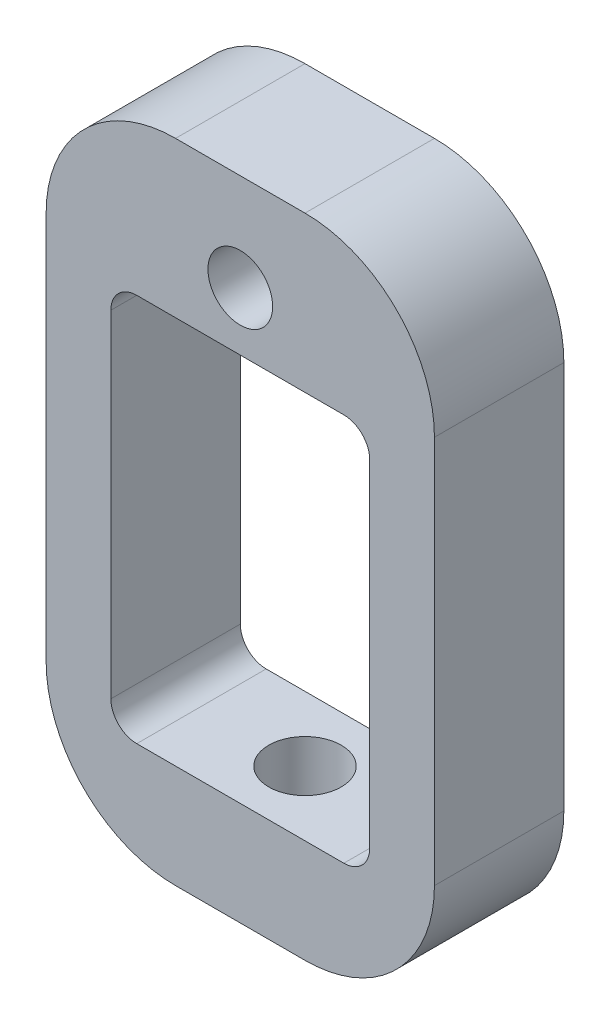
ISO-10303-21;
HEADER;
FILE_DESCRIPTION(('STEP AP214'),'2;1');
FILE_NAME('part.step','',(''),(''),'','','');
FILE_SCHEMA(('AUTOMOTIVE_DESIGN { 1 0 10303 214 1 1 1 1 }'));
ENDSEC;
DATA;
#1=APPLICATION_CONTEXT('core data for automotive mechanical design processes');
#2=APPLICATION_PROTOCOL_DEFINITION('international standard','automotive_design',2000,#1);
#3=PRODUCT_CONTEXT('',#1,'mechanical');
#4=PRODUCT('Part','Part','',(#3));
#5=PRODUCT_RELATED_PRODUCT_CATEGORY('part','',(#4));
#6=PRODUCT_DEFINITION_FORMATION('','',#4);
#7=PRODUCT_DEFINITION_CONTEXT('part definition',#1,'design');
#8=PRODUCT_DEFINITION('design','',#6,#7);
#9=PRODUCT_DEFINITION_SHAPE('','',#8);
#10=(LENGTH_UNIT() NAMED_UNIT(*) SI_UNIT(.MILLI.,.METRE.));
#11=(NAMED_UNIT(*) PLANE_ANGLE_UNIT() SI_UNIT($,.RADIAN.));
#12=(NAMED_UNIT(*) SI_UNIT($,.STERADIAN.) SOLID_ANGLE_UNIT());
#13=UNCERTAINTY_MEASURE_WITH_UNIT(LENGTH_MEASURE(1.E-05),#10,'distance_accuracy_value','');
#14=(GEOMETRIC_REPRESENTATION_CONTEXT(3) GLOBAL_UNCERTAINTY_ASSIGNED_CONTEXT((#13)) GLOBAL_UNIT_ASSIGNED_CONTEXT((#10,
#11,#12)) REPRESENTATION_CONTEXT('',''));
#15=CARTESIAN_POINT('',(0.,0.,0.));
#16=DIRECTION('',(0.,0.,1.));
#17=DIRECTION('',(1.,0.,0.));
#18=AXIS2_PLACEMENT_3D('',#15,#16,#17);
#19=CARTESIAN_POINT('',(0.,0.,5.));
#20=DIRECTION('',(0.,0.,1.));
#21=DIRECTION('',(1.,0.,0.));
#22=AXIS2_PLACEMENT_3D('',#19,#20,#21);
#23=PLANE('',#22);
#24=DIRECTION('',(-1.,0.,0.));
#25=VECTOR('',#24,1.);
#26=CARTESIAN_POINT('',(2.5,-6.,5.));
#27=LINE('',#26,#25);
#28=CARTESIAN_POINT('',(11.5,-6.,5.));
#29=VERTEX_POINT('',#28);
#30=CARTESIAN_POINT('',(3.5,-6.,5.));
#31=VERTEX_POINT('',#30);
#32=EDGE_CURVE('E306',#29,#31,#27,.T.);
#33=ORIENTED_EDGE('',*,*,#32,.F.);
#34=CARTESIAN_POINT('',(11.5,-7.,5.));
#35=DIRECTION('',(0.,0.,1.));
#36=DIRECTION('',(1.,0.,0.));
#37=AXIS2_PLACEMENT_3D('',#34,#35,#36);
#38=CIRCLE('',#37,1.);
#39=CARTESIAN_POINT('',(12.5,-7.,5.));
#40=VERTEX_POINT('',#39);
#41=EDGE_CURVE('E273',#29,#40,#38,.F.);
#42=ORIENTED_EDGE('',*,*,#41,.T.);
#43=DIRECTION('',(0.,1.,0.));
#44=VECTOR('',#43,1.);
#45=CARTESIAN_POINT('',(12.5,-6.,5.));
#46=LINE('',#45,#44);
#47=CARTESIAN_POINT('',(12.5,-20.,5.));
#48=VERTEX_POINT('',#47);
#49=EDGE_CURVE('E292',#48,#40,#46,.T.);
#50=ORIENTED_EDGE('',*,*,#49,.F.);
#51=CARTESIAN_POINT('',(11.5,-20.,5.));
#52=DIRECTION('',(0.,0.,1.));
#53=DIRECTION('',(1.,0.,0.));
#54=AXIS2_PLACEMENT_3D('',#51,#52,#53);
#55=CIRCLE('',#54,1.);
#56=CARTESIAN_POINT('',(11.5,-21.,5.));
#57=VERTEX_POINT('',#56);
#58=EDGE_CURVE('E55',#48,#57,#55,.F.);
#59=ORIENTED_EDGE('',*,*,#58,.T.);
#60=DIRECTION('',(1.,0.,0.));
#61=VECTOR('',#60,1.);
#62=CARTESIAN_POINT('',(2.5,-21.,5.));
#63=LINE('',#62,#61);
#64=CARTESIAN_POINT('',(3.5,-21.,5.));
#65=VERTEX_POINT('',#64);
#66=EDGE_CURVE('E301',#65,#57,#63,.T.);
#67=ORIENTED_EDGE('',*,*,#66,.F.);
#68=CARTESIAN_POINT('',(3.5,-20.,5.));
#69=DIRECTION('',(0.,0.,1.));
#70=DIRECTION('',(1.,0.,0.));
#71=AXIS2_PLACEMENT_3D('',#68,#69,#70);
#72=CIRCLE('',#71,1.);
#73=CARTESIAN_POINT('',(2.5,-20.,5.));
#74=VERTEX_POINT('',#73);
#75=EDGE_CURVE('E11',#65,#74,#72,.F.);
#76=ORIENTED_EDGE('',*,*,#75,.T.);
#77=DIRECTION('',(0.,-1.,0.));
#78=VECTOR('',#77,1.);
#79=CARTESIAN_POINT('',(2.5,-6.,5.));
#80=LINE('',#79,#78);
#81=CARTESIAN_POINT('',(2.5,-7.,5.));
#82=VERTEX_POINT('',#81);
#83=EDGE_CURVE('E299',#82,#74,#80,.T.);
#84=ORIENTED_EDGE('',*,*,#83,.F.);
#85=CARTESIAN_POINT('',(3.5,-7.,5.));
#86=DIRECTION('',(0.,0.,1.));
#87=DIRECTION('',(1.,0.,0.));
#88=AXIS2_PLACEMENT_3D('',#85,#86,#87);
#89=CIRCLE('',#88,1.);
#90=EDGE_CURVE('E267',#82,#31,#89,.F.);
#91=ORIENTED_EDGE('',*,*,#90,.T.);
#92=EDGE_LOOP('',(#33,#42,#50,#59,#67,#76,#84,#91));
#93=FACE_BOUND('',#92,.T.);
#94=DIRECTION('',(1.,0.,0.));
#95=VECTOR('',#94,1.);
#96=CARTESIAN_POINT('',(0.,-25.,5.));
#97=LINE('',#96,#95);
#98=CARTESIAN_POINT('',(5.,-25.,5.));
#99=VERTEX_POINT('',#98);
#100=CARTESIAN_POINT('',(10.,-25.,5.));
#101=VERTEX_POINT('',#100);
#102=EDGE_CURVE('E329',#99,#101,#97,.T.);
#103=ORIENTED_EDGE('',*,*,#102,.T.);
#104=CARTESIAN_POINT('',(10.,-20.,5.));
#105=DIRECTION('',(0.,0.,1.));
#106=DIRECTION('',(1.,0.,0.));
#107=AXIS2_PLACEMENT_3D('',#104,#105,#106);
#108=CIRCLE('',#107,5.);
#109=CARTESIAN_POINT('',(15.,-20.,5.));
#110=VERTEX_POINT('',#109);
#111=EDGE_CURVE('E220',#101,#110,#108,.T.);
#112=ORIENTED_EDGE('',*,*,#111,.T.);
#113=DIRECTION('',(0.,1.,0.));
#114=VECTOR('',#113,1.);
#115=CARTESIAN_POINT('',(15.,0.,5.));
#116=LINE('',#115,#114);
#117=CARTESIAN_POINT('',(15.,-5.,5.));
#118=VERTEX_POINT('',#117);
#119=EDGE_CURVE('E175',#110,#118,#116,.T.);
#120=ORIENTED_EDGE('',*,*,#119,.T.);
#121=CARTESIAN_POINT('',(10.,-5.,5.));
#122=DIRECTION('',(0.,0.,1.));
#123=DIRECTION('',(1.,0.,0.));
#124=AXIS2_PLACEMENT_3D('',#121,#122,#123);
#125=CIRCLE('',#124,5.);
#126=CARTESIAN_POINT('',(9.99999999999999,0.,5.));
#127=VERTEX_POINT('',#126);
#128=EDGE_CURVE('E214',#118,#127,#125,.T.);
#129=ORIENTED_EDGE('',*,*,#128,.T.);
#130=DIRECTION('',(-1.,0.,0.));
#131=VECTOR('',#130,1.);
#132=CARTESIAN_POINT('',(0.,0.,5.));
#133=LINE('',#132,#131);
#134=CARTESIAN_POINT('',(5.,0.,5.));
#135=VERTEX_POINT('',#134);
#136=EDGE_CURVE('E198',#127,#135,#133,.T.);
#137=ORIENTED_EDGE('',*,*,#136,.T.);
#138=CARTESIAN_POINT('',(5.,-5.,5.));
#139=DIRECTION('',(0.,0.,1.));
#140=DIRECTION('',(1.,0.,0.));
#141=AXIS2_PLACEMENT_3D('',#138,#139,#140);
#142=CIRCLE('',#141,5.);
#143=CARTESIAN_POINT('',(0.,-5.,5.));
#144=VERTEX_POINT('',#143);
#145=EDGE_CURVE('E211',#135,#144,#142,.T.);
#146=ORIENTED_EDGE('',*,*,#145,.T.);
#147=DIRECTION('',(0.,-1.,0.));
#148=VECTOR('',#147,1.);
#149=CARTESIAN_POINT('',(0.,0.,5.));
#150=LINE('',#149,#148);
#151=CARTESIAN_POINT('',(0.,-20.,5.));
#152=VERTEX_POINT('',#151);
#153=EDGE_CURVE('E191',#144,#152,#150,.T.);
#154=ORIENTED_EDGE('',*,*,#153,.T.);
#155=CARTESIAN_POINT('',(5.,-20.,5.));
#156=DIRECTION('',(0.,0.,1.));
#157=DIRECTION('',(1.,0.,0.));
#158=AXIS2_PLACEMENT_3D('',#155,#156,#157);
#159=CIRCLE('',#158,5.);
#160=EDGE_CURVE('E217',#152,#99,#159,.T.);
#161=ORIENTED_EDGE('',*,*,#160,.T.);
#162=EDGE_LOOP('',(#103,#112,#120,#129,#137,#146,#154,#161));
#163=FACE_BOUND('',#162,.T.);
#164=CARTESIAN_POINT('',(7.50000000000001,-3.75,5.));
#165=DIRECTION('',(0.,0.,1.));
#166=DIRECTION('',(1.,0.,0.));
#167=AXIS2_PLACEMENT_3D('',#164,#165,#166);
#168=CIRCLE('',#167,1.25);
#169=CARTESIAN_POINT('',(8.75000000000001,-3.75,5.));
#170=VERTEX_POINT('',#169);
#171=EDGE_CURVE('E320',#170,#170,#168,.T.);
#172=ORIENTED_EDGE('',*,*,#171,.F.);
#173=EDGE_LOOP('',(#172));
#174=FACE_BOUND('',#173,.T.);
#175=ADVANCED_FACE('F39',(#93,#163,#174),#23,.T.);
#176=CARTESIAN_POINT('',(0.,0.,0.));
#177=DIRECTION('',(0.,0.,1.));
#178=DIRECTION('',(1.,0.,0.));
#179=AXIS2_PLACEMENT_3D('',#176,#177,#178);
#180=PLANE('',#179);
#181=DIRECTION('',(0.,1.,0.));
#182=VECTOR('',#181,1.);
#183=CARTESIAN_POINT('',(15.,0.,0.));
#184=LINE('',#183,#182);
#185=CARTESIAN_POINT('',(15.,-20.,0.));
#186=VERTEX_POINT('',#185);
#187=CARTESIAN_POINT('',(15.,-5.,0.));
#188=VERTEX_POINT('',#187);
#189=EDGE_CURVE('E172',#186,#188,#184,.T.);
#190=ORIENTED_EDGE('',*,*,#189,.F.);
#191=CARTESIAN_POINT('',(10.,-20.,0.));
#192=DIRECTION('',(0.,0.,1.));
#193=DIRECTION('',(1.,0.,0.));
#194=AXIS2_PLACEMENT_3D('',#191,#192,#193);
#195=CIRCLE('',#194,5.);
#196=CARTESIAN_POINT('',(10.,-25.,0.));
#197=VERTEX_POINT('',#196);
#198=EDGE_CURVE('E154',#186,#197,#195,.F.);
#199=ORIENTED_EDGE('',*,*,#198,.T.);
#200=DIRECTION('',(1.,0.,0.));
#201=VECTOR('',#200,1.);
#202=CARTESIAN_POINT('',(0.,-25.,0.));
#203=LINE('',#202,#201);
#204=CARTESIAN_POINT('',(5.,-25.,0.));
#205=VERTEX_POINT('',#204);
#206=EDGE_CURVE('E186',#205,#197,#203,.T.);
#207=ORIENTED_EDGE('',*,*,#206,.F.);
#208=CARTESIAN_POINT('',(5.,-20.,0.));
#209=DIRECTION('',(0.,0.,1.));
#210=DIRECTION('',(1.,0.,0.));
#211=AXIS2_PLACEMENT_3D('',#208,#209,#210);
#212=CIRCLE('',#211,5.);
#213=CARTESIAN_POINT('',(0.,-20.,0.));
#214=VERTEX_POINT('',#213);
#215=EDGE_CURVE('E166',#205,#214,#212,.F.);
#216=ORIENTED_EDGE('',*,*,#215,.T.);
#217=DIRECTION('',(0.,-1.,0.));
#218=VECTOR('',#217,1.);
#219=CARTESIAN_POINT('',(0.,0.,0.));
#220=LINE('',#219,#218);
#221=CARTESIAN_POINT('',(0.,-5.,0.));
#222=VERTEX_POINT('',#221);
#223=EDGE_CURVE('E193',#222,#214,#220,.T.);
#224=ORIENTED_EDGE('',*,*,#223,.F.);
#225=CARTESIAN_POINT('',(5.,-5.,0.));
#226=DIRECTION('',(0.,0.,1.));
#227=DIRECTION('',(1.,0.,0.));
#228=AXIS2_PLACEMENT_3D('',#225,#226,#227);
#229=CIRCLE('',#228,5.);
#230=CARTESIAN_POINT('',(5.,0.,0.));
#231=VERTEX_POINT('',#230);
#232=EDGE_CURVE('E177',#222,#231,#229,.F.);
#233=ORIENTED_EDGE('',*,*,#232,.T.);
#234=DIRECTION('',(-1.,0.,0.));
#235=VECTOR('',#234,1.);
#236=CARTESIAN_POINT('',(0.,0.,0.));
#237=LINE('',#236,#235);
#238=CARTESIAN_POINT('',(9.99999999999999,0.,0.));
#239=VERTEX_POINT('',#238);
#240=EDGE_CURVE('E185',#239,#231,#237,.T.);
#241=ORIENTED_EDGE('',*,*,#240,.F.);
#242=CARTESIAN_POINT('',(10.,-5.,0.));
#243=DIRECTION('',(0.,0.,1.));
#244=DIRECTION('',(1.,0.,0.));
#245=AXIS2_PLACEMENT_3D('',#242,#243,#244);
#246=CIRCLE('',#245,5.);
#247=EDGE_CURVE('E183',#239,#188,#246,.F.);
#248=ORIENTED_EDGE('',*,*,#247,.T.);
#249=EDGE_LOOP('',(#190,#199,#207,#216,#224,#233,#241,#248));
#250=FACE_BOUND('',#249,.T.);
#251=DIRECTION('',(1.,0.,0.));
#252=VECTOR('',#251,1.);
#253=CARTESIAN_POINT('',(2.5,-21.,0.));
#254=LINE('',#253,#252);
#255=CARTESIAN_POINT('',(3.5,-21.,0.));
#256=VERTEX_POINT('',#255);
#257=CARTESIAN_POINT('',(11.5,-21.,0.));
#258=VERTEX_POINT('',#257);
#259=EDGE_CURVE('E284',#256,#258,#254,.T.);
#260=ORIENTED_EDGE('',*,*,#259,.T.);
#261=CARTESIAN_POINT('',(11.5,-20.,0.));
#262=DIRECTION('',(0.,0.,1.));
#263=DIRECTION('',(1.,0.,0.));
#264=AXIS2_PLACEMENT_3D('',#261,#262,#263);
#265=CIRCLE('',#264,1.);
#266=CARTESIAN_POINT('',(12.5,-20.,0.));
#267=VERTEX_POINT('',#266);
#268=EDGE_CURVE('E276',#258,#267,#265,.T.);
#269=ORIENTED_EDGE('',*,*,#268,.T.);
#270=DIRECTION('',(0.,1.,0.));
#271=VECTOR('',#270,1.);
#272=CARTESIAN_POINT('',(12.5,-6.,0.));
#273=LINE('',#272,#271);
#274=CARTESIAN_POINT('',(12.5,-7.,0.));
#275=VERTEX_POINT('',#274);
#276=EDGE_CURVE('E315',#267,#275,#273,.T.);
#277=ORIENTED_EDGE('',*,*,#276,.T.);
#278=CARTESIAN_POINT('',(11.5,-7.,0.));
#279=DIRECTION('',(0.,0.,1.));
#280=DIRECTION('',(1.,0.,0.));
#281=AXIS2_PLACEMENT_3D('',#278,#279,#280);
#282=CIRCLE('',#281,1.);
#283=CARTESIAN_POINT('',(11.5,-6.,0.));
#284=VERTEX_POINT('',#283);
#285=EDGE_CURVE('E270',#275,#284,#282,.T.);
#286=ORIENTED_EDGE('',*,*,#285,.T.);
#287=DIRECTION('',(-1.,0.,0.));
#288=VECTOR('',#287,1.);
#289=CARTESIAN_POINT('',(2.5,-6.,0.));
#290=LINE('',#289,#288);
#291=CARTESIAN_POINT('',(3.5,-6.,0.));
#292=VERTEX_POINT('',#291);
#293=EDGE_CURVE('E319',#284,#292,#290,.T.);
#294=ORIENTED_EDGE('',*,*,#293,.T.);
#295=CARTESIAN_POINT('',(3.5,-7.,0.));
#296=DIRECTION('',(0.,0.,1.));
#297=DIRECTION('',(1.,0.,0.));
#298=AXIS2_PLACEMENT_3D('',#295,#296,#297);
#299=CIRCLE('',#298,1.);
#300=CARTESIAN_POINT('',(2.5,-7.,0.));
#301=VERTEX_POINT('',#300);
#302=EDGE_CURVE('E264',#292,#301,#299,.T.);
#303=ORIENTED_EDGE('',*,*,#302,.T.);
#304=DIRECTION('',(0.,-1.,0.));
#305=VECTOR('',#304,1.);
#306=CARTESIAN_POINT('',(2.5,-6.,0.));
#307=LINE('',#306,#305);
#308=CARTESIAN_POINT('',(2.5,-20.,0.));
#309=VERTEX_POINT('',#308);
#310=EDGE_CURVE('E286',#301,#309,#307,.T.);
#311=ORIENTED_EDGE('',*,*,#310,.T.);
#312=CARTESIAN_POINT('',(3.5,-20.,0.));
#313=DIRECTION('',(0.,0.,1.));
#314=DIRECTION('',(1.,0.,0.));
#315=AXIS2_PLACEMENT_3D('',#312,#313,#314);
#316=CIRCLE('',#315,1.);
#317=EDGE_CURVE('E48',#309,#256,#316,.T.);
#318=ORIENTED_EDGE('',*,*,#317,.T.);
#319=EDGE_LOOP('',(#260,#269,#277,#286,#294,#303,#311,#318));
#320=FACE_BOUND('',#319,.T.);
#321=CARTESIAN_POINT('',(7.50000000000001,-3.75,0.));
#322=DIRECTION('',(0.,0.,1.));
#323=DIRECTION('',(1.,0.,0.));
#324=AXIS2_PLACEMENT_3D('',#321,#322,#323);
#325=CIRCLE('',#324,1.25);
#326=CARTESIAN_POINT('',(8.75000000000001,-3.75,0.));
#327=VERTEX_POINT('',#326);
#328=EDGE_CURVE('E424',#327,#327,#325,.T.);
#329=ORIENTED_EDGE('',*,*,#328,.T.);
#330=EDGE_LOOP('',(#329));
#331=FACE_BOUND('',#330,.T.);
#332=ADVANCED_FACE('F180',(#250,#320,#331),#180,.F.);
#333=CARTESIAN_POINT('',(0.,0.,5.));
#334=DIRECTION('',(1.,0.,0.));
#335=DIRECTION('',(0.,1.,0.));
#336=AXIS2_PLACEMENT_3D('',#333,#334,#335);
#337=PLANE('',#336);
#338=ORIENTED_EDGE('',*,*,#223,.T.);
#339=DIRECTION('',(0.,0.,-1.));
#340=VECTOR('',#339,1.);
#341=CARTESIAN_POINT('',(0.,-20.,5.));
#342=LINE('',#341,#340);
#343=EDGE_CURVE('E227',#214,#152,#342,.F.);
#344=ORIENTED_EDGE('',*,*,#343,.T.);
#345=ORIENTED_EDGE('',*,*,#153,.F.);
#346=DIRECTION('',(0.,0.,-1.));
#347=VECTOR('',#346,1.);
#348=CARTESIAN_POINT('',(0.,-5.,5.));
#349=LINE('',#348,#347);
#350=EDGE_CURVE('E223',#144,#222,#349,.T.);
#351=ORIENTED_EDGE('',*,*,#350,.T.);
#352=EDGE_LOOP('',(#338,#344,#345,#351));
#353=FACE_BOUND('',#352,.T.);
#354=ADVANCED_FACE('F342',(#353),#337,.F.);
#355=CARTESIAN_POINT('',(0.,-25.,5.));
#356=DIRECTION('',(0.,1.,0.));
#357=DIRECTION('',(0.,0.,1.));
#358=AXIS2_PLACEMENT_3D('',#355,#356,#357);
#359=PLANE('',#358);
#360=CARTESIAN_POINT('',(7.50000000000001,-25.,2.5));
#361=DIRECTION('',(0.,-1.,0.));
#362=DIRECTION('',(0.,0.,-1.));
#363=AXIS2_PLACEMENT_3D('',#360,#361,#362);
#364=CIRCLE('',#363,1.4);
#365=CARTESIAN_POINT('',(7.50000000000001,-25.,1.1));
#366=VERTEX_POINT('',#365);
#367=EDGE_CURVE('E435',#366,#366,#364,.T.);
#368=ORIENTED_EDGE('',*,*,#367,.F.);
#369=EDGE_LOOP('',(#368));
#370=FACE_BOUND('',#369,.T.);
#371=ORIENTED_EDGE('',*,*,#206,.T.);
#372=DIRECTION('',(0.,0.,-1.));
#373=VECTOR('',#372,1.);
#374=CARTESIAN_POINT('',(10.,-25.,5.));
#375=LINE('',#374,#373);
#376=EDGE_CURVE('E159',#197,#101,#375,.F.);
#377=ORIENTED_EDGE('',*,*,#376,.T.);
#378=ORIENTED_EDGE('',*,*,#102,.F.);
#379=DIRECTION('',(0.,0.,-1.));
#380=VECTOR('',#379,1.);
#381=CARTESIAN_POINT('',(5.,-25.,5.));
#382=LINE('',#381,#380);
#383=EDGE_CURVE('E165',#99,#205,#382,.T.);
#384=ORIENTED_EDGE('',*,*,#383,.T.);
#385=EDGE_LOOP('',(#371,#377,#378,#384));
#386=FACE_BOUND('',#385,.T.);
#387=ADVANCED_FACE('F352',(#370,#386),#359,.F.);
#388=CARTESIAN_POINT('',(15.,0.,5.));
#389=DIRECTION('',(-1.,0.,0.));
#390=DIRECTION('',(0.,-1.,0.));
#391=AXIS2_PLACEMENT_3D('',#388,#389,#390);
#392=PLANE('',#391);
#393=ORIENTED_EDGE('',*,*,#119,.F.);
#394=DIRECTION('',(0.,0.,-1.));
#395=VECTOR('',#394,1.);
#396=CARTESIAN_POINT('',(15.,-20.,5.));
#397=LINE('',#396,#395);
#398=EDGE_CURVE('E158',#110,#186,#397,.T.);
#399=ORIENTED_EDGE('',*,*,#398,.T.);
#400=ORIENTED_EDGE('',*,*,#189,.T.);
#401=DIRECTION('',(0.,0.,-1.));
#402=VECTOR('',#401,1.);
#403=CARTESIAN_POINT('',(15.,-5.,5.));
#404=LINE('',#403,#402);
#405=EDGE_CURVE('E178',#188,#118,#404,.F.);
#406=ORIENTED_EDGE('',*,*,#405,.T.);
#407=EDGE_LOOP('',(#393,#399,#400,#406));
#408=FACE_BOUND('',#407,.T.);
#409=ADVANCED_FACE('F171',(#408),#392,.F.);
#410=CARTESIAN_POINT('',(0.,0.,5.));
#411=DIRECTION('',(0.,-1.,0.));
#412=DIRECTION('',(0.,0.,-1.));
#413=AXIS2_PLACEMENT_3D('',#410,#411,#412);
#414=PLANE('',#413);
#415=ORIENTED_EDGE('',*,*,#136,.F.);
#416=DIRECTION('',(0.,0.,-1.));
#417=VECTOR('',#416,1.);
#418=CARTESIAN_POINT('',(10.,0.,5.));
#419=LINE('',#418,#417);
#420=EDGE_CURVE('E233',#127,#239,#419,.T.);
#421=ORIENTED_EDGE('',*,*,#420,.T.);
#422=ORIENTED_EDGE('',*,*,#240,.T.);
#423=DIRECTION('',(0.,0.,-1.));
#424=VECTOR('',#423,1.);
#425=CARTESIAN_POINT('',(5.,0.,5.));
#426=LINE('',#425,#424);
#427=EDGE_CURVE('E230',#231,#135,#426,.F.);
#428=ORIENTED_EDGE('',*,*,#427,.T.);
#429=EDGE_LOOP('',(#415,#421,#422,#428));
#430=FACE_BOUND('',#429,.T.);
#431=ADVANCED_FACE('F360',(#430),#414,.F.);
#432=CARTESIAN_POINT('',(12.5,-6.,5.));
#433=DIRECTION('',(-1.,0.,0.));
#434=DIRECTION('',(0.,-1.,0.));
#435=AXIS2_PLACEMENT_3D('',#432,#433,#434);
#436=PLANE('',#435);
#437=ORIENTED_EDGE('',*,*,#49,.T.);
#438=DIRECTION('',(0.,0.,-1.));
#439=VECTOR('',#438,1.);
#440=CARTESIAN_POINT('',(12.5,-7.,0.));
#441=LINE('',#440,#439);
#442=EDGE_CURVE('E254',#40,#275,#441,.T.);
#443=ORIENTED_EDGE('',*,*,#442,.T.);
#444=ORIENTED_EDGE('',*,*,#276,.F.);
#445=DIRECTION('',(0.,0.,-1.));
#446=VECTOR('',#445,1.);
#447=CARTESIAN_POINT('',(12.5,-20.,5.));
#448=LINE('',#447,#446);
#449=EDGE_CURVE('E251',#267,#48,#448,.F.);
#450=ORIENTED_EDGE('',*,*,#449,.T.);
#451=EDGE_LOOP('',(#437,#443,#444,#450));
#452=FACE_BOUND('',#451,.T.);
#453=ADVANCED_FACE('F371',(#452),#436,.T.);
#454=CARTESIAN_POINT('',(2.5,-6.,5.));
#455=DIRECTION('',(0.,-1.,0.));
#456=DIRECTION('',(0.,0.,-1.));
#457=AXIS2_PLACEMENT_3D('',#454,#455,#456);
#458=PLANE('',#457);
#459=ORIENTED_EDGE('',*,*,#32,.T.);
#460=DIRECTION('',(0.,0.,-1.));
#461=VECTOR('',#460,1.);
#462=CARTESIAN_POINT('',(3.5,-6.,0.));
#463=LINE('',#462,#461);
#464=EDGE_CURVE('E240',#31,#292,#463,.T.);
#465=ORIENTED_EDGE('',*,*,#464,.T.);
#466=ORIENTED_EDGE('',*,*,#293,.F.);
#467=DIRECTION('',(0.,0.,-1.));
#468=VECTOR('',#467,1.);
#469=CARTESIAN_POINT('',(11.5,-6.,5.));
#470=LINE('',#469,#468);
#471=EDGE_CURVE('E237',#284,#29,#470,.F.);
#472=ORIENTED_EDGE('',*,*,#471,.T.);
#473=EDGE_LOOP('',(#459,#465,#466,#472));
#474=FACE_BOUND('',#473,.T.);
#475=ADVANCED_FACE('F379',(#474),#458,.T.);
#476=CARTESIAN_POINT('',(2.5,-6.,5.));
#477=DIRECTION('',(1.,0.,0.));
#478=DIRECTION('',(0.,1.,0.));
#479=AXIS2_PLACEMENT_3D('',#476,#477,#478);
#480=PLANE('',#479);
#481=ORIENTED_EDGE('',*,*,#310,.F.);
#482=DIRECTION('',(0.,0.,-1.));
#483=VECTOR('',#482,1.);
#484=CARTESIAN_POINT('',(2.5,-7.,5.));
#485=LINE('',#484,#483);
#486=EDGE_CURVE('E248',#301,#82,#485,.F.);
#487=ORIENTED_EDGE('',*,*,#486,.T.);
#488=ORIENTED_EDGE('',*,*,#83,.T.);
#489=DIRECTION('',(0.,0.,-1.));
#490=VECTOR('',#489,1.);
#491=CARTESIAN_POINT('',(2.5,-20.,0.));
#492=LINE('',#491,#490);
#493=EDGE_CURVE('E244',#74,#309,#492,.T.);
#494=ORIENTED_EDGE('',*,*,#493,.T.);
#495=EDGE_LOOP('',(#481,#487,#488,#494));
#496=FACE_BOUND('',#495,.T.);
#497=ADVANCED_FACE('F303',(#496),#480,.T.);
#498=CARTESIAN_POINT('',(2.5,-21.,5.));
#499=DIRECTION('',(0.,1.,0.));
#500=DIRECTION('',(0.,0.,1.));
#501=AXIS2_PLACEMENT_3D('',#498,#499,#500);
#502=PLANE('',#501);
#503=CARTESIAN_POINT('',(7.50000000000001,-21.,2.5));
#504=DIRECTION('',(0.,1.,0.));
#505=DIRECTION('',(0.,0.,1.));
#506=AXIS2_PLACEMENT_3D('',#503,#504,#505);
#507=CIRCLE('',#506,1.4);
#508=CARTESIAN_POINT('',(7.50000000000001,-21.,3.9));
#509=VERTEX_POINT('',#508);
#510=EDGE_CURVE('E428',#509,#509,#507,.F.);
#511=ORIENTED_EDGE('',*,*,#510,.T.);
#512=EDGE_LOOP('',(#511));
#513=FACE_BOUND('',#512,.T.);
#514=ORIENTED_EDGE('',*,*,#66,.T.);
#515=DIRECTION('',(0.,0.,-1.));
#516=VECTOR('',#515,1.);
#517=CARTESIAN_POINT('',(11.5,-21.,0.));
#518=LINE('',#517,#516);
#519=EDGE_CURVE('E260',#57,#258,#518,.T.);
#520=ORIENTED_EDGE('',*,*,#519,.T.);
#521=ORIENTED_EDGE('',*,*,#259,.F.);
#522=DIRECTION('',(0.,0.,-1.));
#523=VECTOR('',#522,1.);
#524=CARTESIAN_POINT('',(3.5,-21.,5.));
#525=LINE('',#524,#523);
#526=EDGE_CURVE('E62',#256,#65,#525,.F.);
#527=ORIENTED_EDGE('',*,*,#526,.T.);
#528=EDGE_LOOP('',(#514,#520,#521,#527));
#529=FACE_BOUND('',#528,.T.);
#530=ADVANCED_FACE('F289',(#513,#529),#502,.T.);
#531=CARTESIAN_POINT('',(7.50000000000001,-3.75,5.));
#532=DIRECTION('',(0.,0.,-1.));
#533=DIRECTION('',(-1.,0.,0.));
#534=AXIS2_PLACEMENT_3D('',#531,#532,#533);
#535=CYLINDRICAL_SURFACE('',#534,1.25);
#536=ORIENTED_EDGE('',*,*,#171,.T.);
#537=EDGE_LOOP('',(#536));
#538=FACE_BOUND('',#537,.T.);
#539=ORIENTED_EDGE('',*,*,#328,.F.);
#540=EDGE_LOOP('',(#539));
#541=FACE_BOUND('',#540,.T.);
#542=ADVANCED_FACE('F442',(#538,#541),#535,.F.);
#543=CARTESIAN_POINT('',(7.50000000000001,-17.0402020253553,2.5));
#544=DIRECTION('',(0.,-1.,0.));
#545=DIRECTION('',(0.,0.,-1.));
#546=AXIS2_PLACEMENT_3D('',#543,#544,#545);
#547=CYLINDRICAL_SURFACE('',#546,1.4);
#548=ORIENTED_EDGE('',*,*,#367,.T.);
#549=EDGE_LOOP('',(#548));
#550=FACE_BOUND('',#549,.T.);
#551=ORIENTED_EDGE('',*,*,#510,.F.);
#552=EDGE_LOOP('',(#551));
#553=FACE_BOUND('',#552,.T.);
#554=ADVANCED_FACE('F439',(#550,#553),#547,.F.);
#555=CARTESIAN_POINT('',(10.,-20.,5.));
#556=DIRECTION('',(0.,0.,-1.));
#557=DIRECTION('',(-1.,0.,0.));
#558=AXIS2_PLACEMENT_3D('',#555,#556,#557);
#559=CYLINDRICAL_SURFACE('',#558,5.);
#560=ORIENTED_EDGE('',*,*,#111,.F.);
#561=ORIENTED_EDGE('',*,*,#376,.F.);
#562=ORIENTED_EDGE('',*,*,#198,.F.);
#563=ORIENTED_EDGE('',*,*,#398,.F.);
#564=EDGE_LOOP('',(#560,#561,#562,#563));
#565=FACE_BOUND('',#564,.T.);
#566=ADVANCED_FACE('F157',(#565),#559,.T.);
#567=CARTESIAN_POINT('',(5.,-20.,5.));
#568=DIRECTION('',(0.,0.,-1.));
#569=DIRECTION('',(-1.,0.,0.));
#570=AXIS2_PLACEMENT_3D('',#567,#568,#569);
#571=CYLINDRICAL_SURFACE('',#570,5.);
#572=ORIENTED_EDGE('',*,*,#160,.F.);
#573=ORIENTED_EDGE('',*,*,#343,.F.);
#574=ORIENTED_EDGE('',*,*,#215,.F.);
#575=ORIENTED_EDGE('',*,*,#383,.F.);
#576=EDGE_LOOP('',(#572,#573,#574,#575));
#577=FACE_BOUND('',#576,.T.);
#578=ADVANCED_FACE('F347',(#577),#571,.T.);
#579=CARTESIAN_POINT('',(10.,-5.,5.));
#580=DIRECTION('',(0.,0.,-1.));
#581=DIRECTION('',(-1.,0.,0.));
#582=AXIS2_PLACEMENT_3D('',#579,#580,#581);
#583=CYLINDRICAL_SURFACE('',#582,5.);
#584=ORIENTED_EDGE('',*,*,#128,.F.);
#585=ORIENTED_EDGE('',*,*,#405,.F.);
#586=ORIENTED_EDGE('',*,*,#247,.F.);
#587=ORIENTED_EDGE('',*,*,#420,.F.);
#588=EDGE_LOOP('',(#584,#585,#586,#587));
#589=FACE_BOUND('',#588,.T.);
#590=ADVANCED_FACE('F387',(#589),#583,.T.);
#591=CARTESIAN_POINT('',(5.,-5.,5.));
#592=DIRECTION('',(0.,0.,-1.));
#593=DIRECTION('',(-1.,0.,0.));
#594=AXIS2_PLACEMENT_3D('',#591,#592,#593);
#595=CYLINDRICAL_SURFACE('',#594,5.);
#596=ORIENTED_EDGE('',*,*,#145,.F.);
#597=ORIENTED_EDGE('',*,*,#427,.F.);
#598=ORIENTED_EDGE('',*,*,#232,.F.);
#599=ORIENTED_EDGE('',*,*,#350,.F.);
#600=EDGE_LOOP('',(#596,#597,#598,#599));
#601=FACE_BOUND('',#600,.T.);
#602=ADVANCED_FACE('F389',(#601),#595,.T.);
#603=CARTESIAN_POINT('',(3.5,-7.,5.));
#604=DIRECTION('',(0.,0.,1.));
#605=DIRECTION('',(1.,0.,0.));
#606=AXIS2_PLACEMENT_3D('',#603,#604,#605);
#607=CYLINDRICAL_SURFACE('',#606,1.);
#608=ORIENTED_EDGE('',*,*,#90,.F.);
#609=ORIENTED_EDGE('',*,*,#486,.F.);
#610=ORIENTED_EDGE('',*,*,#302,.F.);
#611=ORIENTED_EDGE('',*,*,#464,.F.);
#612=EDGE_LOOP('',(#608,#609,#610,#611));
#613=FACE_BOUND('',#612,.T.);
#614=ADVANCED_FACE('F395',(#613),#607,.F.);
#615=CARTESIAN_POINT('',(11.5,-7.,5.));
#616=DIRECTION('',(0.,0.,1.));
#617=DIRECTION('',(1.,0.,0.));
#618=AXIS2_PLACEMENT_3D('',#615,#616,#617);
#619=CYLINDRICAL_SURFACE('',#618,1.);
#620=ORIENTED_EDGE('',*,*,#41,.F.);
#621=ORIENTED_EDGE('',*,*,#471,.F.);
#622=ORIENTED_EDGE('',*,*,#285,.F.);
#623=ORIENTED_EDGE('',*,*,#442,.F.);
#624=EDGE_LOOP('',(#620,#621,#622,#623));
#625=FACE_BOUND('',#624,.T.);
#626=ADVANCED_FACE('F403',(#625),#619,.F.);
#627=CARTESIAN_POINT('',(11.5,-20.,5.));
#628=DIRECTION('',(0.,0.,1.));
#629=DIRECTION('',(1.,0.,0.));
#630=AXIS2_PLACEMENT_3D('',#627,#628,#629);
#631=CYLINDRICAL_SURFACE('',#630,1.);
#632=ORIENTED_EDGE('',*,*,#58,.F.);
#633=ORIENTED_EDGE('',*,*,#449,.F.);
#634=ORIENTED_EDGE('',*,*,#268,.F.);
#635=ORIENTED_EDGE('',*,*,#519,.F.);
#636=EDGE_LOOP('',(#632,#633,#634,#635));
#637=FACE_BOUND('',#636,.T.);
#638=ADVANCED_FACE('F406',(#637),#631,.F.);
#639=CARTESIAN_POINT('',(3.5,-20.,5.));
#640=DIRECTION('',(0.,0.,1.));
#641=DIRECTION('',(1.,0.,0.));
#642=AXIS2_PLACEMENT_3D('',#639,#640,#641);
#643=CYLINDRICAL_SURFACE('',#642,1.);
#644=ORIENTED_EDGE('',*,*,#75,.F.);
#645=ORIENTED_EDGE('',*,*,#526,.F.);
#646=ORIENTED_EDGE('',*,*,#317,.F.);
#647=ORIENTED_EDGE('',*,*,#493,.F.);
#648=EDGE_LOOP('',(#644,#645,#646,#647));
#649=FACE_BOUND('',#648,.T.);
#650=ADVANCED_FACE('F41',(#649),#643,.F.);
#651=CLOSED_SHELL('',(#175,#332,#354,#387,#409,#431,#453,#475,#497,#530,#542,#554,#566,#578,
#590,#602,#614,#626,#638,#650));
#652=MANIFOLD_SOLID_BREP('B2',#651);
#653=ADVANCED_BREP_SHAPE_REPRESENTATION('',(#18,#652),#14);
#654=SHAPE_DEFINITION_REPRESENTATION(#9,#653);
ENDSEC;
END-ISO-10303-21;
